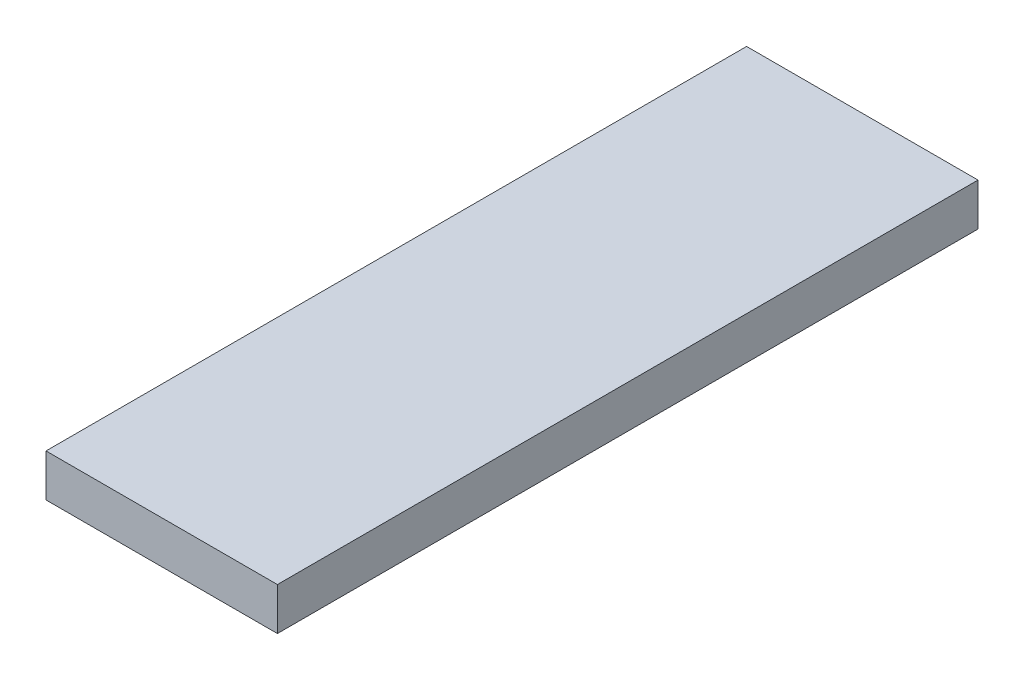
ISO-10303-21;
HEADER;
FILE_DESCRIPTION(('STEP AP214'),'2;1');
FILE_NAME('part.step','',(''),(''),'','','');
FILE_SCHEMA(('AUTOMOTIVE_DESIGN { 1 0 10303 214 1 1 1 1 }'));
ENDSEC;
DATA;
#1=APPLICATION_CONTEXT('core data for automotive mechanical design processes');
#2=APPLICATION_PROTOCOL_DEFINITION('international standard','automotive_design',2000,#1);
#3=PRODUCT_CONTEXT('',#1,'mechanical');
#4=PRODUCT('Part','Part','',(#3));
#5=PRODUCT_RELATED_PRODUCT_CATEGORY('part','',(#4));
#6=PRODUCT_DEFINITION_FORMATION('','',#4);
#7=PRODUCT_DEFINITION_CONTEXT('part definition',#1,'design');
#8=PRODUCT_DEFINITION('design','',#6,#7);
#9=PRODUCT_DEFINITION_SHAPE('','',#8);
#10=(LENGTH_UNIT() NAMED_UNIT(*) SI_UNIT(.MILLI.,.METRE.));
#11=(NAMED_UNIT(*) PLANE_ANGLE_UNIT() SI_UNIT($,.RADIAN.));
#12=(NAMED_UNIT(*) SI_UNIT($,.STERADIAN.) SOLID_ANGLE_UNIT());
#13=UNCERTAINTY_MEASURE_WITH_UNIT(LENGTH_MEASURE(1.E-05),#10,'distance_accuracy_value','');
#14=(GEOMETRIC_REPRESENTATION_CONTEXT(3) GLOBAL_UNCERTAINTY_ASSIGNED_CONTEXT((#13)) GLOBAL_UNIT_ASSIGNED_CONTEXT((#10,
#11,#12)) REPRESENTATION_CONTEXT('',''));
#15=CARTESIAN_POINT('',(0.,0.,0.));
#16=DIRECTION('',(0.,0.,1.));
#17=DIRECTION('',(1.,0.,0.));
#18=AXIS2_PLACEMENT_3D('',#15,#16,#17);
#19=CARTESIAN_POINT('',(0.,10.,-165.));
#20=DIRECTION('',(1.,0.,0.));
#21=DIRECTION('',(0.,0.,-1.));
#22=AXIS2_PLACEMENT_3D('',#19,#20,#21);
#23=PLANE('',#22);
#24=DIRECTION('',(0.,0.,1.));
#25=VECTOR('',#24,1.);
#26=CARTESIAN_POINT('',(0.,0.,-165.));
#27=LINE('',#26,#25);
#28=CARTESIAN_POINT('',(0.,0.,-165.));
#29=VERTEX_POINT('',#28);
#30=CARTESIAN_POINT('',(0.,0.,0.));
#31=VERTEX_POINT('',#30);
#32=EDGE_CURVE('E99',#29,#31,#27,.T.);
#33=ORIENTED_EDGE('',*,*,#32,.T.);
#34=DIRECTION('',(0.,-1.,0.));
#35=VECTOR('',#34,1.);
#36=CARTESIAN_POINT('',(0.,10.,0.));
#37=LINE('',#36,#35);
#38=CARTESIAN_POINT('',(0.,10.,0.));
#39=VERTEX_POINT('',#38);
#40=EDGE_CURVE('E11',#39,#31,#37,.T.);
#41=ORIENTED_EDGE('',*,*,#40,.F.);
#42=DIRECTION('',(0.,0.,1.));
#43=VECTOR('',#42,1.);
#44=CARTESIAN_POINT('',(0.,10.,-165.));
#45=LINE('',#44,#43);
#46=CARTESIAN_POINT('',(0.,10.,-165.));
#47=VERTEX_POINT('',#46);
#48=EDGE_CURVE('E87',#47,#39,#45,.T.);
#49=ORIENTED_EDGE('',*,*,#48,.F.);
#50=DIRECTION('',(0.,-1.,0.));
#51=VECTOR('',#50,1.);
#52=CARTESIAN_POINT('',(0.,10.,-165.));
#53=LINE('',#52,#51);
#54=EDGE_CURVE('E95',#47,#29,#53,.T.);
#55=ORIENTED_EDGE('',*,*,#54,.T.);
#56=EDGE_LOOP('',(#33,#41,#49,#55));
#57=FACE_BOUND('',#56,.T.);
#58=ADVANCED_FACE('F36',(#57),#23,.F.);
#59=CARTESIAN_POINT('',(0.,10.,0.));
#60=DIRECTION('',(0.,0.,-1.));
#61=DIRECTION('',(-1.,0.,0.));
#62=AXIS2_PLACEMENT_3D('',#59,#60,#61);
#63=PLANE('',#62);
#64=DIRECTION('',(1.,0.,0.));
#65=VECTOR('',#64,1.);
#66=CARTESIAN_POINT('',(0.,0.,0.));
#67=LINE('',#66,#65);
#68=CARTESIAN_POINT('',(54.5,0.,0.));
#69=VERTEX_POINT('',#68);
#70=EDGE_CURVE('E91',#31,#69,#67,.T.);
#71=ORIENTED_EDGE('',*,*,#70,.T.);
#72=DIRECTION('',(0.,-1.,0.));
#73=VECTOR('',#72,1.);
#74=CARTESIAN_POINT('',(54.5,10.,0.));
#75=LINE('',#74,#73);
#76=CARTESIAN_POINT('',(54.5,10.,0.));
#77=VERTEX_POINT('',#76);
#78=EDGE_CURVE('E44',#77,#69,#75,.T.);
#79=ORIENTED_EDGE('',*,*,#78,.F.);
#80=DIRECTION('',(1.,0.,0.));
#81=VECTOR('',#80,1.);
#82=CARTESIAN_POINT('',(0.,10.,0.));
#83=LINE('',#82,#81);
#84=EDGE_CURVE('E82',#39,#77,#83,.T.);
#85=ORIENTED_EDGE('',*,*,#84,.F.);
#86=ORIENTED_EDGE('',*,*,#40,.T.);
#87=EDGE_LOOP('',(#71,#79,#85,#86));
#88=FACE_BOUND('',#87,.T.);
#89=ADVANCED_FACE('F90',(#88),#63,.F.);
#90=CARTESIAN_POINT('',(54.5,10.,-165.));
#91=DIRECTION('',(-1.,0.,0.));
#92=DIRECTION('',(0.,0.,1.));
#93=AXIS2_PLACEMENT_3D('',#90,#91,#92);
#94=PLANE('',#93);
#95=DIRECTION('',(0.,0.,-1.));
#96=VECTOR('',#95,1.);
#97=CARTESIAN_POINT('',(54.5,0.,-165.));
#98=LINE('',#97,#96);
#99=CARTESIAN_POINT('',(54.5,0.,-165.));
#100=VERTEX_POINT('',#99);
#101=EDGE_CURVE('E69',#69,#100,#98,.T.);
#102=ORIENTED_EDGE('',*,*,#101,.T.);
#103=DIRECTION('',(0.,-1.,0.));
#104=VECTOR('',#103,1.);
#105=CARTESIAN_POINT('',(54.5,10.,-165.));
#106=LINE('',#105,#104);
#107=CARTESIAN_POINT('',(54.5,10.,-165.));
#108=VERTEX_POINT('',#107);
#109=EDGE_CURVE('E92',#108,#100,#106,.T.);
#110=ORIENTED_EDGE('',*,*,#109,.F.);
#111=DIRECTION('',(0.,0.,-1.));
#112=VECTOR('',#111,1.);
#113=CARTESIAN_POINT('',(54.5,10.,-165.));
#114=LINE('',#113,#112);
#115=EDGE_CURVE('E85',#77,#108,#114,.T.);
#116=ORIENTED_EDGE('',*,*,#115,.F.);
#117=ORIENTED_EDGE('',*,*,#78,.T.);
#118=EDGE_LOOP('',(#102,#110,#116,#117));
#119=FACE_BOUND('',#118,.T.);
#120=ADVANCED_FACE('F93',(#119),#94,.F.);
#121=CARTESIAN_POINT('',(0.,10.,-165.));
#122=DIRECTION('',(0.,0.,1.));
#123=DIRECTION('',(1.,0.,0.));
#124=AXIS2_PLACEMENT_3D('',#121,#122,#123);
#125=PLANE('',#124);
#126=DIRECTION('',(-1.,0.,0.));
#127=VECTOR('',#126,1.);
#128=CARTESIAN_POINT('',(0.,0.,-165.));
#129=LINE('',#128,#127);
#130=EDGE_CURVE('E75',#100,#29,#129,.T.);
#131=ORIENTED_EDGE('',*,*,#130,.T.);
#132=ORIENTED_EDGE('',*,*,#54,.F.);
#133=DIRECTION('',(-1.,0.,0.));
#134=VECTOR('',#133,1.);
#135=CARTESIAN_POINT('',(0.,10.,-165.));
#136=LINE('',#135,#134);
#137=EDGE_CURVE('E52',#108,#47,#136,.T.);
#138=ORIENTED_EDGE('',*,*,#137,.F.);
#139=ORIENTED_EDGE('',*,*,#109,.T.);
#140=EDGE_LOOP('',(#131,#132,#138,#139));
#141=FACE_BOUND('',#140,.T.);
#142=ADVANCED_FACE('F106',(#141),#125,.F.);
#143=CARTESIAN_POINT('',(0.,10.,0.));
#144=DIRECTION('',(0.,1.,0.));
#145=DIRECTION('',(0.,0.,1.));
#146=AXIS2_PLACEMENT_3D('',#143,#144,#145);
#147=PLANE('',#146);
#148=ORIENTED_EDGE('',*,*,#48,.T.);
#149=ORIENTED_EDGE('',*,*,#84,.T.);
#150=ORIENTED_EDGE('',*,*,#115,.T.);
#151=ORIENTED_EDGE('',*,*,#137,.T.);
#152=EDGE_LOOP('',(#148,#149,#150,#151));
#153=FACE_BOUND('',#152,.T.);
#154=ADVANCED_FACE('F83',(#153),#147,.T.);
#155=CARTESIAN_POINT('',(0.,0.,0.));
#156=DIRECTION('',(0.,1.,0.));
#157=DIRECTION('',(0.,0.,1.));
#158=AXIS2_PLACEMENT_3D('',#155,#156,#157);
#159=PLANE('',#158);
#160=ORIENTED_EDGE('',*,*,#32,.F.);
#161=ORIENTED_EDGE('',*,*,#130,.F.);
#162=ORIENTED_EDGE('',*,*,#101,.F.);
#163=ORIENTED_EDGE('',*,*,#70,.F.);
#164=EDGE_LOOP('',(#160,#161,#162,#163));
#165=FACE_BOUND('',#164,.T.);
#166=ADVANCED_FACE('F109',(#165),#159,.F.);
#167=CLOSED_SHELL('',(#58,#89,#120,#142,#154,#166));
#168=MANIFOLD_SOLID_BREP('B2',#167);
#169=ADVANCED_BREP_SHAPE_REPRESENTATION('',(#18,#168),#14);
#170=SHAPE_DEFINITION_REPRESENTATION(#9,#169);
ENDSEC;
END-ISO-10303-21;
